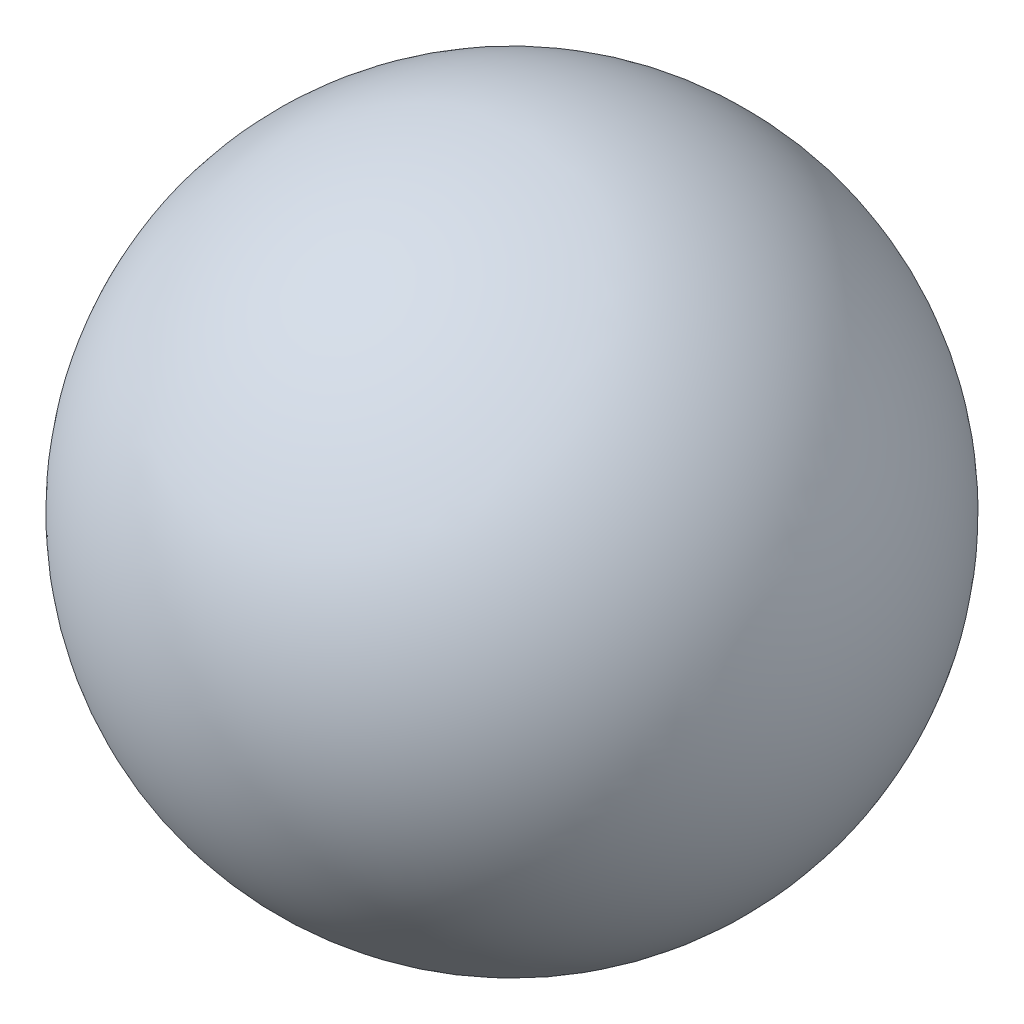
ISO-10303-21;
HEADER;
FILE_DESCRIPTION(('STEP AP214'),'2;1');
FILE_NAME('part.step','',(''),(''),'','','');
FILE_SCHEMA(('AUTOMOTIVE_DESIGN { 1 0 10303 214 1 1 1 1 }'));
ENDSEC;
DATA;
#1=APPLICATION_CONTEXT('core data for automotive mechanical design processes');
#2=APPLICATION_PROTOCOL_DEFINITION('international standard','automotive_design',2000,#1);
#3=PRODUCT_CONTEXT('',#1,'mechanical');
#4=PRODUCT('Part','Part','',(#3));
#5=PRODUCT_RELATED_PRODUCT_CATEGORY('part','',(#4));
#6=PRODUCT_DEFINITION_FORMATION('','',#4);
#7=PRODUCT_DEFINITION_CONTEXT('part definition',#1,'design');
#8=PRODUCT_DEFINITION('design','',#6,#7);
#9=PRODUCT_DEFINITION_SHAPE('','',#8);
#10=(LENGTH_UNIT() NAMED_UNIT(*) SI_UNIT(.MILLI.,.METRE.));
#11=(NAMED_UNIT(*) PLANE_ANGLE_UNIT() SI_UNIT($,.RADIAN.));
#12=(NAMED_UNIT(*) SI_UNIT($,.STERADIAN.) SOLID_ANGLE_UNIT());
#13=UNCERTAINTY_MEASURE_WITH_UNIT(LENGTH_MEASURE(1.E-05),#10,'distance_accuracy_value','');
#14=(GEOMETRIC_REPRESENTATION_CONTEXT(3) GLOBAL_UNCERTAINTY_ASSIGNED_CONTEXT((#13)) GLOBAL_UNIT_ASSIGNED_CONTEXT((#10,
#11,#12)) REPRESENTATION_CONTEXT('',''));
#15=CARTESIAN_POINT('',(0.,0.,0.));
#16=DIRECTION('',(0.,0.,1.));
#17=DIRECTION('',(1.,0.,0.));
#18=AXIS2_PLACEMENT_3D('',#15,#16,#17);
#19=CARTESIAN_POINT('',(0.63517975025291,0.,0.));
#20=DIRECTION('',(-1.,0.,0.));
#21=DIRECTION('',(0.,1.,0.));
#22=AXIS2_PLACEMENT_3D('',#19,#20,#21);
#23=SPHERICAL_SURFACE('',#22,11.);
#24=CARTESIAN_POINT('',(-10.3648202497471,0.,0.));
#25=VERTEX_POINT('',#24);
#26=VERTEX_LOOP('',#25);
#27=FACE_BOUND('',#26,.T.);
#28=ADVANCED_FACE('F37',(#27),#23,.T.);
#29=CLOSED_SHELL('',(#28));
#30=MANIFOLD_SOLID_BREP('B2',#29);
#31=ADVANCED_BREP_SHAPE_REPRESENTATION('',(#18,#30),#14);
#32=SHAPE_DEFINITION_REPRESENTATION(#9,#31);
ENDSEC;
END-ISO-10303-21;
